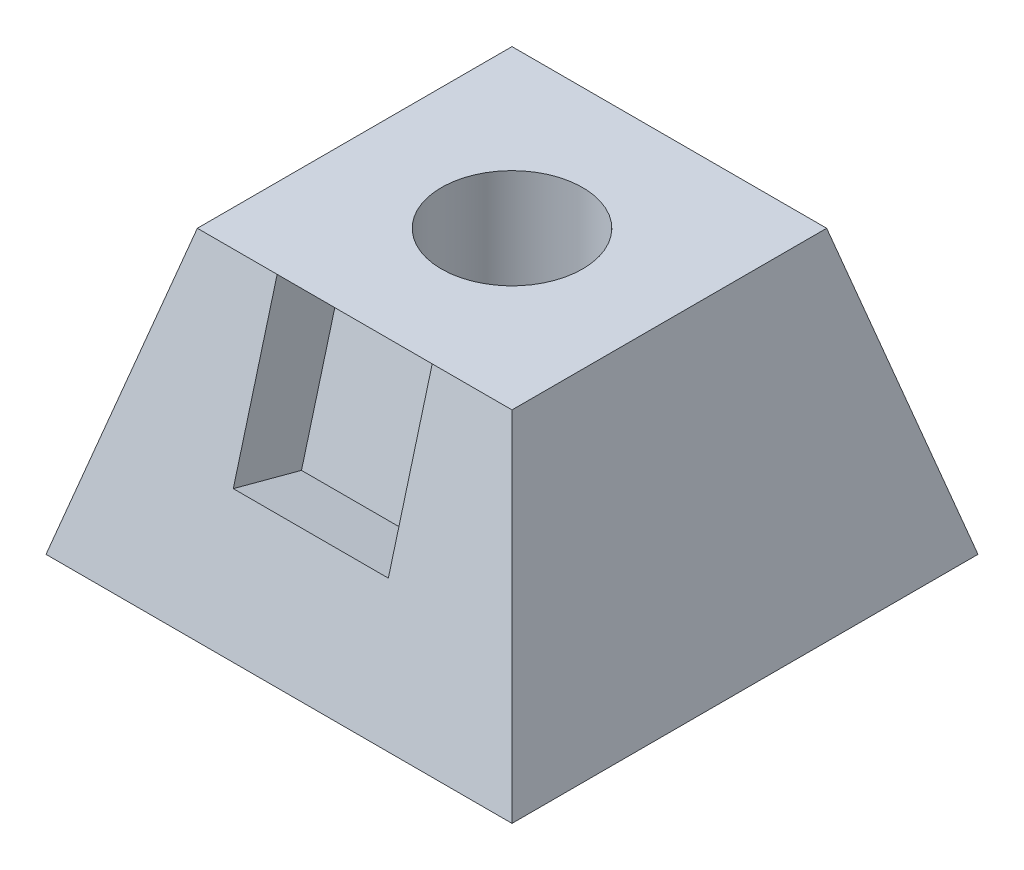
ISO-10303-21;
HEADER;
FILE_DESCRIPTION(('STEP AP214'),'2;1');
FILE_NAME('part.step','',(''),(''),'','','');
FILE_SCHEMA(('AUTOMOTIVE_DESIGN { 1 0 10303 214 1 1 1 1 }'));
ENDSEC;
DATA;
#1=APPLICATION_CONTEXT('core data for automotive mechanical design processes');
#2=APPLICATION_PROTOCOL_DEFINITION('international standard','automotive_design',2000,#1);
#3=PRODUCT_CONTEXT('',#1,'mechanical');
#4=PRODUCT('Part','Part','',(#3));
#5=PRODUCT_RELATED_PRODUCT_CATEGORY('part','',(#4));
#6=PRODUCT_DEFINITION_FORMATION('','',#4);
#7=PRODUCT_DEFINITION_CONTEXT('part definition',#1,'design');
#8=PRODUCT_DEFINITION('design','',#6,#7);
#9=PRODUCT_DEFINITION_SHAPE('','',#8);
#10=(LENGTH_UNIT() NAMED_UNIT(*) SI_UNIT(.MILLI.,.METRE.));
#11=(NAMED_UNIT(*) PLANE_ANGLE_UNIT() SI_UNIT($,.RADIAN.));
#12=(NAMED_UNIT(*) SI_UNIT($,.STERADIAN.) SOLID_ANGLE_UNIT());
#13=UNCERTAINTY_MEASURE_WITH_UNIT(LENGTH_MEASURE(1.E-05),#10,'distance_accuracy_value','');
#14=(GEOMETRIC_REPRESENTATION_CONTEXT(3) GLOBAL_UNCERTAINTY_ASSIGNED_CONTEXT((#13)) GLOBAL_UNIT_ASSIGNED_CONTEXT((#10,
#11,#12)) REPRESENTATION_CONTEXT('',''));
#15=CARTESIAN_POINT('',(0.,0.,0.));
#16=DIRECTION('',(0.,0.,1.));
#17=DIRECTION('',(1.,0.,0.));
#18=AXIS2_PLACEMENT_3D('',#15,#16,#17);
#19=CARTESIAN_POINT('',(-165.,0.,165.));
#20=DIRECTION('',(-0.965925826289068,0.258819045102521,0.));
#21=DIRECTION('',(-0.258819045102521,-0.965925826289068,0.));
#22=AXIS2_PLACEMENT_3D('',#19,#20,#21);
#23=PLANE('',#22);
#24=DIRECTION('',(0.,0.,-1.));
#25=VECTOR('',#24,1.);
#26=CARTESIAN_POINT('',(-165.,0.,165.));
#27=LINE('',#26,#25);
#28=CARTESIAN_POINT('',(-165.,0.,165.));
#29=VERTEX_POINT('',#28);
#30=CARTESIAN_POINT('',(-165.,0.,-165.));
#31=VERTEX_POINT('',#30);
#32=EDGE_CURVE('E150',#29,#31,#27,.T.);
#33=ORIENTED_EDGE('',*,*,#32,.F.);
#34=DIRECTION('',(0.250562807085732,0.935113126531029,-0.250562807085732));
#35=VECTOR('',#34,1.);
#36=CARTESIAN_POINT('',(-165.,0.,165.));
#37=LINE('',#36,#35);
#38=CARTESIAN_POINT('',(-111.410161513775,200.,111.410161513775));
#39=VERTEX_POINT('',#38);
#40=EDGE_CURVE('E11',#39,#29,#37,.F.);
#41=ORIENTED_EDGE('',*,*,#40,.F.);
#42=DIRECTION('',(0.,0.,-1.));
#43=VECTOR('',#42,1.);
#44=CARTESIAN_POINT('',(-111.410161513775,200.,0.));
#45=LINE('',#44,#43);
#46=CARTESIAN_POINT('',(-111.410161513775,200.,-111.410161513775));
#47=VERTEX_POINT('',#46);
#48=EDGE_CURVE('E161',#39,#47,#45,.T.);
#49=ORIENTED_EDGE('',*,*,#48,.T.);
#50=DIRECTION('',(-0.250562807085732,-0.935113126531029,-0.250562807085732));
#51=VECTOR('',#50,1.);
#52=CARTESIAN_POINT('',(-144.282032302755,77.3205080756888,-144.282032302755));
#53=LINE('',#52,#51);
#54=EDGE_CURVE('E72',#47,#31,#53,.T.);
#55=ORIENTED_EDGE('',*,*,#54,.T.);
#56=EDGE_LOOP('',(#33,#41,#49,#55));
#57=FACE_BOUND('',#56,.T.);
#58=ADVANCED_FACE('F32',(#57),#23,.T.);
#59=CARTESIAN_POINT('',(-165.,0.,165.));
#60=DIRECTION('',(0.,0.258819045102521,0.965925826289068));
#61=DIRECTION('',(0.,-0.965925826289068,0.258819045102521));
#62=AXIS2_PLACEMENT_3D('',#59,#60,#61);
#63=PLANE('',#62);
#64=DIRECTION('',(-1.,0.,0.));
#65=VECTOR('',#64,1.);
#66=CARTESIAN_POINT('',(0.,200.,111.410161513775));
#67=LINE('',#66,#65);
#68=CARTESIAN_POINT('',(54.9,200.,111.410161513775));
#69=VERTEX_POINT('',#68);
#70=CARTESIAN_POINT('',(111.410161513775,200.,111.410161513775));
#71=VERTEX_POINT('',#70);
#72=EDGE_CURVE('E170',#69,#71,#67,.F.);
#73=ORIENTED_EDGE('',*,*,#72,.F.);
#74=DIRECTION('',(0.,0.965925826289068,-0.258819045102521));
#75=VECTOR('',#74,1.);
#76=CARTESIAN_POINT('',(54.9,84.0889008453118,142.468446926078));
#77=LINE('',#76,#75);
#78=CARTESIAN_POINT('',(54.9,84.0889008453118,142.468446926078));
#79=VERTEX_POINT('',#78);
#80=EDGE_CURVE('E49',#79,#69,#77,.T.);
#81=ORIENTED_EDGE('',*,*,#80,.F.);
#82=DIRECTION('',(1.,0.,0.));
#83=VECTOR('',#82,1.);
#84=CARTESIAN_POINT('',(-54.9,84.0889008453118,142.468446926078));
#85=LINE('',#84,#83);
#86=CARTESIAN_POINT('',(-54.9,84.0889008453118,142.468446926078));
#87=VERTEX_POINT('',#86);
#88=EDGE_CURVE('E128',#87,#79,#85,.T.);
#89=ORIENTED_EDGE('',*,*,#88,.F.);
#90=DIRECTION('',(0.,-0.965925826289068,0.258819045102521));
#91=VECTOR('',#90,1.);
#92=CARTESIAN_POINT('',(-54.9,84.0889008453118,142.468446926078));
#93=LINE('',#92,#91);
#94=CARTESIAN_POINT('',(-54.9,200.,111.410161513776));
#95=VERTEX_POINT('',#94);
#96=EDGE_CURVE('E131',#95,#87,#93,.T.);
#97=ORIENTED_EDGE('',*,*,#96,.F.);
#98=EDGE_CURVE('E165',#39,#95,#67,.F.);
#99=ORIENTED_EDGE('',*,*,#98,.F.);
#100=ORIENTED_EDGE('',*,*,#40,.T.);
#101=DIRECTION('',(1.,0.,0.));
#102=VECTOR('',#101,1.);
#103=CARTESIAN_POINT('',(-165.,0.,165.));
#104=LINE('',#103,#102);
#105=CARTESIAN_POINT('',(165.,0.,165.));
#106=VERTEX_POINT('',#105);
#107=EDGE_CURVE('E80',#29,#106,#104,.T.);
#108=ORIENTED_EDGE('',*,*,#107,.T.);
#109=DIRECTION('',(0.250562807085732,-0.935113126531029,0.250562807085732));
#110=VECTOR('',#109,1.);
#111=CARTESIAN_POINT('',(165.,0.,165.));
#112=LINE('',#111,#110);
#113=EDGE_CURVE('E41',#71,#106,#112,.T.);
#114=ORIENTED_EDGE('',*,*,#113,.F.);
#115=EDGE_LOOP('',(#73,#81,#89,#97,#99,#100,#108,#114));
#116=FACE_BOUND('',#115,.T.);
#117=ADVANCED_FACE('F34',(#116),#63,.T.);
#118=CARTESIAN_POINT('',(165.,0.,165.));
#119=DIRECTION('',(0.965925826289068,0.258819045102521,0.));
#120=DIRECTION('',(-0.258819045102521,0.965925826289068,0.));
#121=AXIS2_PLACEMENT_3D('',#118,#119,#120);
#122=PLANE('',#121);
#123=DIRECTION('',(0.,0.,-1.));
#124=VECTOR('',#123,1.);
#125=CARTESIAN_POINT('',(165.,0.,165.));
#126=LINE('',#125,#124);
#127=CARTESIAN_POINT('',(165.,0.,-165.));
#128=VERTEX_POINT('',#127);
#129=EDGE_CURVE('E158',#106,#128,#126,.T.);
#130=ORIENTED_EDGE('',*,*,#129,.T.);
#131=DIRECTION('',(-0.250562807085732,0.935113126531029,0.250562807085732));
#132=VECTOR('',#131,1.);
#133=CARTESIAN_POINT('',(144.282032302755,77.3205080756888,-144.282032302755));
#134=LINE('',#133,#132);
#135=CARTESIAN_POINT('',(111.410161513775,200.,-111.410161513775));
#136=VERTEX_POINT('',#135);
#137=EDGE_CURVE('E164',#136,#128,#134,.F.);
#138=ORIENTED_EDGE('',*,*,#137,.F.);
#139=DIRECTION('',(0.,0.,1.));
#140=VECTOR('',#139,1.);
#141=CARTESIAN_POINT('',(111.410161513775,200.,0.));
#142=LINE('',#141,#140);
#143=EDGE_CURVE('E171',#71,#136,#142,.F.);
#144=ORIENTED_EDGE('',*,*,#143,.F.);
#145=ORIENTED_EDGE('',*,*,#113,.T.);
#146=EDGE_LOOP('',(#130,#138,#144,#145));
#147=FACE_BOUND('',#146,.T.);
#148=ADVANCED_FACE('F182',(#147),#122,.T.);
#149=CARTESIAN_POINT('',(-165.,0.,-165.));
#150=DIRECTION('',(0.,0.258819045102521,-0.965925826289068));
#151=DIRECTION('',(0.,0.965925826289068,0.258819045102521));
#152=AXIS2_PLACEMENT_3D('',#149,#150,#151);
#153=PLANE('',#152);
#154=DIRECTION('',(1.,0.,0.));
#155=VECTOR('',#154,1.);
#156=CARTESIAN_POINT('',(-165.,0.,-165.));
#157=LINE('',#156,#155);
#158=EDGE_CURVE('E155',#31,#128,#157,.T.);
#159=ORIENTED_EDGE('',*,*,#158,.F.);
#160=ORIENTED_EDGE('',*,*,#54,.F.);
#161=DIRECTION('',(1.,0.,0.));
#162=VECTOR('',#161,1.);
#163=CARTESIAN_POINT('',(0.,200.,-111.410161513775));
#164=LINE('',#163,#162);
#165=EDGE_CURVE('E36',#47,#136,#164,.T.);
#166=ORIENTED_EDGE('',*,*,#165,.T.);
#167=ORIENTED_EDGE('',*,*,#137,.T.);
#168=EDGE_LOOP('',(#159,#160,#166,#167));
#169=FACE_BOUND('',#168,.T.);
#170=ADVANCED_FACE('F175',(#169),#153,.T.);
#171=CARTESIAN_POINT('',(0.,200.,0.));
#172=DIRECTION('',(0.,-1.,0.));
#173=DIRECTION('',(0.,0.,-1.));
#174=AXIS2_PLACEMENT_3D('',#171,#172,#173);
#175=PLANE('',#174);
#176=CARTESIAN_POINT('',(0.,200.,0.));
#177=DIRECTION('',(0.,1.,0.));
#178=DIRECTION('',(0.,0.,1.));
#179=AXIS2_PLACEMENT_3D('',#176,#177,#178);
#180=CIRCLE('',#179,50.);
#181=CARTESIAN_POINT('',(0.,200.,50.));
#182=VERTEX_POINT('',#181);
#183=EDGE_CURVE('E143',#182,#182,#180,.T.);
#184=ORIENTED_EDGE('',*,*,#183,.F.);
#185=EDGE_LOOP('',(#184));
#186=FACE_BOUND('',#185,.T.);
#187=ORIENTED_EDGE('',*,*,#48,.F.);
#188=ORIENTED_EDGE('',*,*,#98,.T.);
#189=DIRECTION('',(-1.,0.,0.));
#190=VECTOR('',#189,1.);
#191=CARTESIAN_POINT('',(-54.9,200.,111.410161513776));
#192=LINE('',#191,#190);
#193=EDGE_CURVE('E137',#69,#95,#192,.T.);
#194=ORIENTED_EDGE('',*,*,#193,.F.);
#195=ORIENTED_EDGE('',*,*,#72,.T.);
#196=ORIENTED_EDGE('',*,*,#143,.T.);
#197=ORIENTED_EDGE('',*,*,#165,.F.);
#198=EDGE_LOOP('',(#187,#188,#194,#195,#196,#197));
#199=FACE_BOUND('',#198,.T.);
#200=ADVANCED_FACE('F177',(#186,#199),#175,.F.);
#201=CARTESIAN_POINT('',(0.,0.,0.));
#202=DIRECTION('',(0.,-1.,0.));
#203=DIRECTION('',(0.,0.,-1.));
#204=AXIS2_PLACEMENT_3D('',#201,#202,#203);
#205=PLANE('',#204);
#206=ORIENTED_EDGE('',*,*,#32,.T.);
#207=ORIENTED_EDGE('',*,*,#158,.T.);
#208=ORIENTED_EDGE('',*,*,#129,.F.);
#209=ORIENTED_EDGE('',*,*,#107,.F.);
#210=EDGE_LOOP('',(#206,#207,#208,#209));
#211=FACE_BOUND('',#210,.T.);
#212=ADVANCED_FACE('F180',(#211),#205,.T.);
#213=CARTESIAN_POINT('',(0.,30.,0.));
#214=DIRECTION('',(0.,1.,0.));
#215=DIRECTION('',(0.,0.,1.));
#216=AXIS2_PLACEMENT_3D('',#213,#214,#215);
#217=CYLINDRICAL_SURFACE('',#216,50.);
#218=CARTESIAN_POINT('',(0.,30.,0.));
#219=DIRECTION('',(0.,1.,0.));
#220=DIRECTION('',(0.,0.,1.));
#221=AXIS2_PLACEMENT_3D('',#218,#219,#220);
#222=CIRCLE('',#221,50.);
#223=CARTESIAN_POINT('',(0.,30.,50.));
#224=VERTEX_POINT('',#223);
#225=EDGE_CURVE('E147',#224,#224,#222,.T.);
#226=ORIENTED_EDGE('',*,*,#225,.F.);
#227=EDGE_LOOP('',(#226));
#228=FACE_BOUND('',#227,.T.);
#229=ORIENTED_EDGE('',*,*,#183,.T.);
#230=EDGE_LOOP('',(#229));
#231=FACE_BOUND('',#230,.T.);
#232=ADVANCED_FACE('F231',(#228,#231),#217,.F.);
#233=CARTESIAN_POINT('',(0.,30.,0.));
#234=DIRECTION('',(0.,1.,0.));
#235=DIRECTION('',(0.,0.,1.));
#236=AXIS2_PLACEMENT_3D('',#233,#234,#235);
#237=PLANE('',#236);
#238=ORIENTED_EDGE('',*,*,#225,.T.);
#239=EDGE_LOOP('',(#238));
#240=FACE_BOUND('',#239,.T.);
#241=ADVANCED_FACE('F197',(#240),#237,.T.);
#242=CARTESIAN_POINT('',(54.9,71.1479485901858,94.1721556116246));
#243=DIRECTION('',(1.,0.,0.));
#244=DIRECTION('',(0.,0.,-1.));
#245=AXIS2_PLACEMENT_3D('',#242,#243,#244);
#246=PLANE('',#245);
#247=ORIENTED_EDGE('',*,*,#80,.T.);
#248=DIRECTION('',(0.,0.258819045102521,0.965925826289068));
#249=VECTOR('',#248,1.);
#250=CARTESIAN_POINT('',(54.9,187.059047744874,63.1138701993221));
#251=LINE('',#250,#249);
#252=CARTESIAN_POINT('',(54.9,187.059047744874,63.1138701993221));
#253=VERTEX_POINT('',#252);
#254=EDGE_CURVE('E106',#253,#69,#251,.T.);
#255=ORIENTED_EDGE('',*,*,#254,.F.);
#256=DIRECTION('',(0.,0.965925826289068,-0.258819045102521));
#257=VECTOR('',#256,1.);
#258=CARTESIAN_POINT('',(54.9,71.1479485901858,94.1721556116246));
#259=LINE('',#258,#257);
#260=CARTESIAN_POINT('',(54.9,71.1479485901858,94.1721556116246));
#261=VERTEX_POINT('',#260);
#262=EDGE_CURVE('E110',#261,#253,#259,.T.);
#263=ORIENTED_EDGE('',*,*,#262,.F.);
#264=DIRECTION('',(0.,0.258819045102521,0.965925826289068));
#265=VECTOR('',#264,1.);
#266=CARTESIAN_POINT('',(54.9,71.1479485901858,94.1721556116246));
#267=LINE('',#266,#265);
#268=EDGE_CURVE('E141',#261,#79,#267,.T.);
#269=ORIENTED_EDGE('',*,*,#268,.T.);
#270=EDGE_LOOP('',(#247,#255,#263,#269));
#271=FACE_BOUND('',#270,.T.);
#272=ADVANCED_FACE('F108',(#271),#246,.F.);
#273=CARTESIAN_POINT('',(-54.9,71.1479485901858,94.1721556116246));
#274=DIRECTION('',(0.,-0.965925826289068,0.258819045102521));
#275=DIRECTION('',(0.,-0.258819045102521,-0.965925826289068));
#276=AXIS2_PLACEMENT_3D('',#273,#274,#275);
#277=PLANE('',#276);
#278=ORIENTED_EDGE('',*,*,#88,.T.);
#279=ORIENTED_EDGE('',*,*,#268,.F.);
#280=DIRECTION('',(1.,0.,0.));
#281=VECTOR('',#280,1.);
#282=CARTESIAN_POINT('',(-54.9,71.1479485901858,94.1721556116246));
#283=LINE('',#282,#281);
#284=CARTESIAN_POINT('',(-54.9,71.1479485901858,94.1721556116246));
#285=VERTEX_POINT('',#284);
#286=EDGE_CURVE('E116',#285,#261,#283,.T.);
#287=ORIENTED_EDGE('',*,*,#286,.F.);
#288=DIRECTION('',(0.,0.258819045102521,0.965925826289068));
#289=VECTOR('',#288,1.);
#290=CARTESIAN_POINT('',(-54.9,71.1479485901858,94.1721556116246));
#291=LINE('',#290,#289);
#292=EDGE_CURVE('E144',#285,#87,#291,.T.);
#293=ORIENTED_EDGE('',*,*,#292,.T.);
#294=EDGE_LOOP('',(#278,#279,#287,#293));
#295=FACE_BOUND('',#294,.T.);
#296=ADVANCED_FACE('F189',(#295),#277,.F.);
#297=CARTESIAN_POINT('',(-54.9,71.1479485901858,94.1721556116246));
#298=DIRECTION('',(-1.,0.,0.));
#299=DIRECTION('',(0.,0.,1.));
#300=AXIS2_PLACEMENT_3D('',#297,#298,#299);
#301=PLANE('',#300);
#302=ORIENTED_EDGE('',*,*,#96,.T.);
#303=ORIENTED_EDGE('',*,*,#292,.F.);
#304=DIRECTION('',(0.,-0.965925826289068,0.258819045102521));
#305=VECTOR('',#304,1.);
#306=CARTESIAN_POINT('',(-54.9,71.1479485901858,94.1721556116246));
#307=LINE('',#306,#305);
#308=CARTESIAN_POINT('',(-54.9,187.059047744874,63.1138701993221));
#309=VERTEX_POINT('',#308);
#310=EDGE_CURVE('E124',#309,#285,#307,.T.);
#311=ORIENTED_EDGE('',*,*,#310,.F.);
#312=DIRECTION('',(0.,0.258819045102521,0.965925826289068));
#313=VECTOR('',#312,1.);
#314=CARTESIAN_POINT('',(-54.9,187.059047744874,63.1138701993221));
#315=LINE('',#314,#313);
#316=EDGE_CURVE('E115',#309,#95,#315,.T.);
#317=ORIENTED_EDGE('',*,*,#316,.T.);
#318=EDGE_LOOP('',(#302,#303,#311,#317));
#319=FACE_BOUND('',#318,.T.);
#320=ADVANCED_FACE('F187',(#319),#301,.F.);
#321=CARTESIAN_POINT('',(-54.9,187.059047744874,63.1138701993221));
#322=DIRECTION('',(0.,0.965925826289068,-0.258819045102521));
#323=DIRECTION('',(0.,0.258819045102521,0.965925826289068));
#324=AXIS2_PLACEMENT_3D('',#321,#322,#323);
#325=PLANE('',#324);
#326=ORIENTED_EDGE('',*,*,#193,.T.);
#327=ORIENTED_EDGE('',*,*,#316,.F.);
#328=DIRECTION('',(-1.,0.,0.));
#329=VECTOR('',#328,1.);
#330=CARTESIAN_POINT('',(-54.9,187.059047744874,63.1138701993221));
#331=LINE('',#330,#329);
#332=EDGE_CURVE('E119',#253,#309,#331,.T.);
#333=ORIENTED_EDGE('',*,*,#332,.F.);
#334=ORIENTED_EDGE('',*,*,#254,.T.);
#335=EDGE_LOOP('',(#326,#327,#333,#334));
#336=FACE_BOUND('',#335,.T.);
#337=ADVANCED_FACE('F120',(#336),#325,.F.);
#338=CARTESIAN_POINT('',(0.,28.309047744874,105.650804497763));
#339=DIRECTION('',(0.,-0.258819045102521,-0.965925826289068));
#340=DIRECTION('',(0.,0.965925826289068,-0.258819045102521));
#341=AXIS2_PLACEMENT_3D('',#338,#339,#340);
#342=PLANE('',#341);
#343=ORIENTED_EDGE('',*,*,#262,.T.);
#344=ORIENTED_EDGE('',*,*,#332,.T.);
#345=ORIENTED_EDGE('',*,*,#310,.T.);
#346=ORIENTED_EDGE('',*,*,#286,.T.);
#347=EDGE_LOOP('',(#343,#344,#345,#346));
#348=FACE_BOUND('',#347,.T.);
#349=ADVANCED_FACE('F126',(#348),#342,.F.);
#350=CLOSED_SHELL('',(#58,#117,#148,#170,#200,#212,#232,#241,#272,#296,#320,#337,#349));
#351=MANIFOLD_SOLID_BREP('B2',#350);
#352=ADVANCED_BREP_SHAPE_REPRESENTATION('',(#18,#351),#14);
#353=SHAPE_DEFINITION_REPRESENTATION(#9,#352);
ENDSEC;
END-ISO-10303-21;
